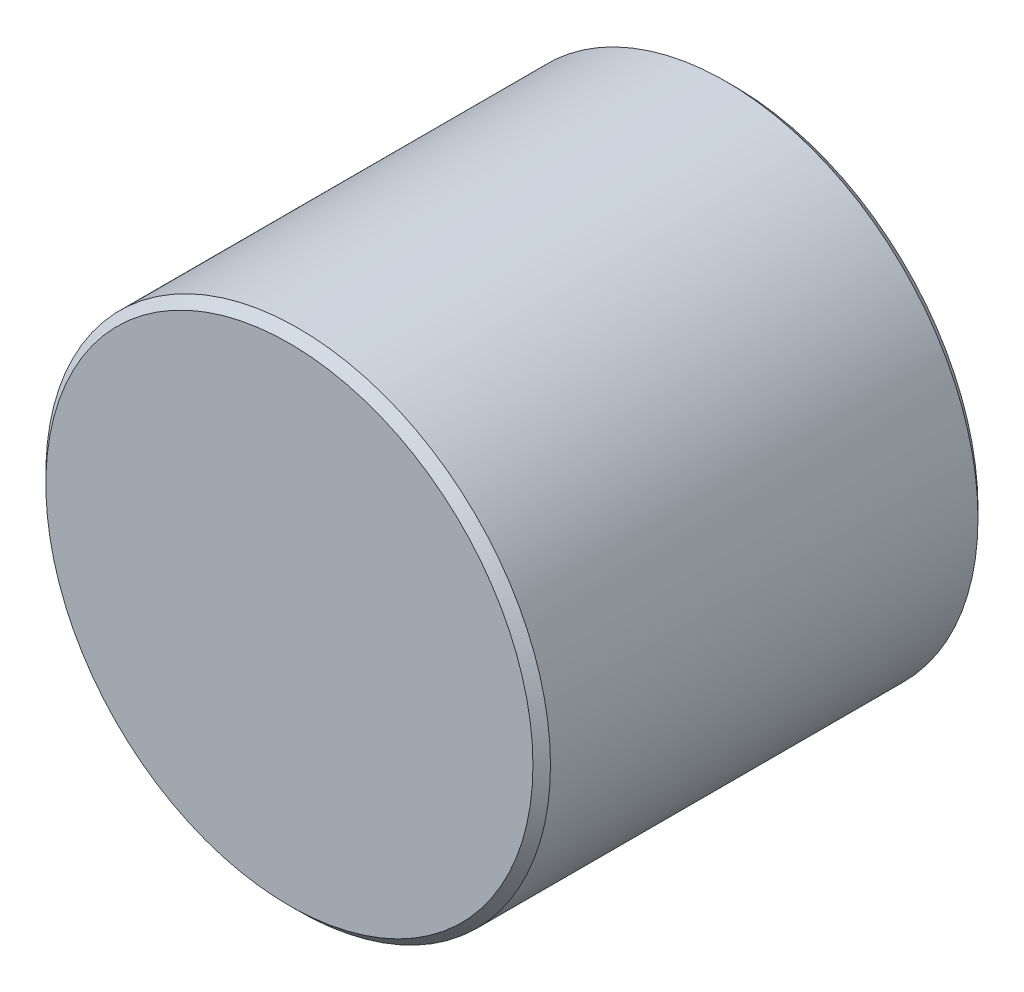
ISO-10303-21;
HEADER;
FILE_DESCRIPTION(('STEP AP214'),'2;1');
FILE_NAME('part.step','',(''),(''),'','','');
FILE_SCHEMA(('AUTOMOTIVE_DESIGN { 1 0 10303 214 1 1 1 1 }'));
ENDSEC;
DATA;
#1=APPLICATION_CONTEXT('core data for automotive mechanical design processes');
#2=APPLICATION_PROTOCOL_DEFINITION('international standard','automotive_design',2000,#1);
#3=PRODUCT_CONTEXT('',#1,'mechanical');
#4=PRODUCT('Part','Part','',(#3));
#5=PRODUCT_RELATED_PRODUCT_CATEGORY('part','',(#4));
#6=PRODUCT_DEFINITION_FORMATION('','',#4);
#7=PRODUCT_DEFINITION_CONTEXT('part definition',#1,'design');
#8=PRODUCT_DEFINITION('design','',#6,#7);
#9=PRODUCT_DEFINITION_SHAPE('','',#8);
#10=(LENGTH_UNIT() NAMED_UNIT(*) SI_UNIT(.MILLI.,.METRE.));
#11=(NAMED_UNIT(*) PLANE_ANGLE_UNIT() SI_UNIT($,.RADIAN.));
#12=(NAMED_UNIT(*) SI_UNIT($,.STERADIAN.) SOLID_ANGLE_UNIT());
#13=UNCERTAINTY_MEASURE_WITH_UNIT(LENGTH_MEASURE(1.E-05),#10,'distance_accuracy_value','');
#14=(GEOMETRIC_REPRESENTATION_CONTEXT(3) GLOBAL_UNCERTAINTY_ASSIGNED_CONTEXT((#13)) GLOBAL_UNIT_ASSIGNED_CONTEXT((#10,
#11,#12)) REPRESENTATION_CONTEXT('',''));
#15=CARTESIAN_POINT('',(0.,0.,0.));
#16=DIRECTION('',(0.,0.,1.));
#17=DIRECTION('',(1.,0.,0.));
#18=AXIS2_PLACEMENT_3D('',#15,#16,#17);
#19=CARTESIAN_POINT('',(0.,0.,6.35));
#20=DIRECTION('',(0.,0.,-1.));
#21=DIRECTION('',(-1.,0.,0.));
#22=AXIS2_PLACEMENT_3D('',#19,#20,#21);
#23=CYLINDRICAL_SURFACE('',#22,7.2);
#24=CARTESIAN_POINT('',(0.,0.,-6.1));
#25=DIRECTION('',(0.,0.,1.));
#26=DIRECTION('',(1.,0.,0.));
#27=AXIS2_PLACEMENT_3D('',#24,#25,#26);
#28=CIRCLE('',#27,7.2);
#29=CARTESIAN_POINT('',(7.2,0.,-6.1));
#30=VERTEX_POINT('',#29);
#31=EDGE_CURVE('E41',#30,#30,#28,.T.);
#32=ORIENTED_EDGE('',*,*,#31,.T.);
#33=EDGE_LOOP('',(#32));
#34=FACE_BOUND('',#33,.T.);
#35=CARTESIAN_POINT('',(0.,0.,6.09999999999999));
#36=DIRECTION('',(0.,0.,1.));
#37=DIRECTION('',(1.,0.,0.));
#38=AXIS2_PLACEMENT_3D('',#35,#36,#37);
#39=CIRCLE('',#38,7.2);
#40=CARTESIAN_POINT('',(7.2,0.,6.09999999999999));
#41=VERTEX_POINT('',#40);
#42=EDGE_CURVE('E45',#41,#41,#39,.F.);
#43=ORIENTED_EDGE('',*,*,#42,.T.);
#44=EDGE_LOOP('',(#43));
#45=FACE_BOUND('',#44,.T.);
#46=ADVANCED_FACE('F30',(#34,#45),#23,.T.);
#47=CARTESIAN_POINT('',(0.,0.,6.35));
#48=DIRECTION('',(0.,0.,1.));
#49=DIRECTION('',(1.,0.,0.));
#50=AXIS2_PLACEMENT_3D('',#47,#48,#49);
#51=PLANE('',#50);
#52=CARTESIAN_POINT('',(0.,0.,6.35));
#53=DIRECTION('',(0.,0.,1.));
#54=DIRECTION('',(1.,0.,0.));
#55=AXIS2_PLACEMENT_3D('',#52,#53,#54);
#56=CIRCLE('',#55,6.94999999999999);
#57=CARTESIAN_POINT('',(6.94999999999999,0.,6.35));
#58=VERTEX_POINT('',#57);
#59=EDGE_CURVE('E10',#58,#58,#56,.T.);
#60=ORIENTED_EDGE('',*,*,#59,.T.);
#61=EDGE_LOOP('',(#60));
#62=FACE_BOUND('',#61,.T.);
#63=ADVANCED_FACE('F61',(#62),#51,.T.);
#64=CARTESIAN_POINT('',(0.,0.,-6.35));
#65=DIRECTION('',(0.,0.,1.));
#66=DIRECTION('',(1.,0.,0.));
#67=AXIS2_PLACEMENT_3D('',#64,#65,#66);
#68=PLANE('',#67);
#69=CARTESIAN_POINT('',(0.,0.,-6.35));
#70=DIRECTION('',(0.,0.,1.));
#71=DIRECTION('',(1.,0.,0.));
#72=AXIS2_PLACEMENT_3D('',#69,#70,#71);
#73=CIRCLE('',#72,6.95);
#74=CARTESIAN_POINT('',(6.95,0.,-6.35));
#75=VERTEX_POINT('',#74);
#76=EDGE_CURVE('E37',#75,#75,#73,.F.);
#77=ORIENTED_EDGE('',*,*,#76,.T.);
#78=EDGE_LOOP('',(#77));
#79=FACE_BOUND('',#78,.T.);
#80=ADVANCED_FACE('F58',(#79),#68,.F.);
#81=CARTESIAN_POINT('',(0.,0.,-6.1));
#82=DIRECTION('',(0.,0.,1.));
#83=DIRECTION('',(1.,0.,0.));
#84=AXIS2_PLACEMENT_3D('',#81,#82,#83);
#85=CONICAL_SURFACE('',#84,7.2,0.785398163397448);
#86=ORIENTED_EDGE('',*,*,#76,.F.);
#87=EDGE_LOOP('',(#86));
#88=FACE_BOUND('',#87,.T.);
#89=ORIENTED_EDGE('',*,*,#31,.F.);
#90=EDGE_LOOP('',(#89));
#91=FACE_BOUND('',#90,.T.);
#92=ADVANCED_FACE('F54',(#88,#91),#85,.T.);
#93=CARTESIAN_POINT('',(0.,0.,6.35));
#94=DIRECTION('',(0.,0.,-1.));
#95=DIRECTION('',(-1.,0.,0.));
#96=AXIS2_PLACEMENT_3D('',#93,#94,#95);
#97=CONICAL_SURFACE('',#96,6.94999999999999,0.785398163397448);
#98=ORIENTED_EDGE('',*,*,#42,.F.);
#99=EDGE_LOOP('',(#98));
#100=FACE_BOUND('',#99,.T.);
#101=ORIENTED_EDGE('',*,*,#59,.F.);
#102=EDGE_LOOP('',(#101));
#103=FACE_BOUND('',#102,.T.);
#104=ADVANCED_FACE('F32',(#100,#103),#97,.T.);
#105=CLOSED_SHELL('',(#46,#63,#80,#92,#104));
#106=MANIFOLD_SOLID_BREP('B2',#105);
#107=ADVANCED_BREP_SHAPE_REPRESENTATION('',(#18,#106),#14);
#108=SHAPE_DEFINITION_REPRESENTATION(#9,#107);
ENDSEC;
END-ISO-10303-21;
